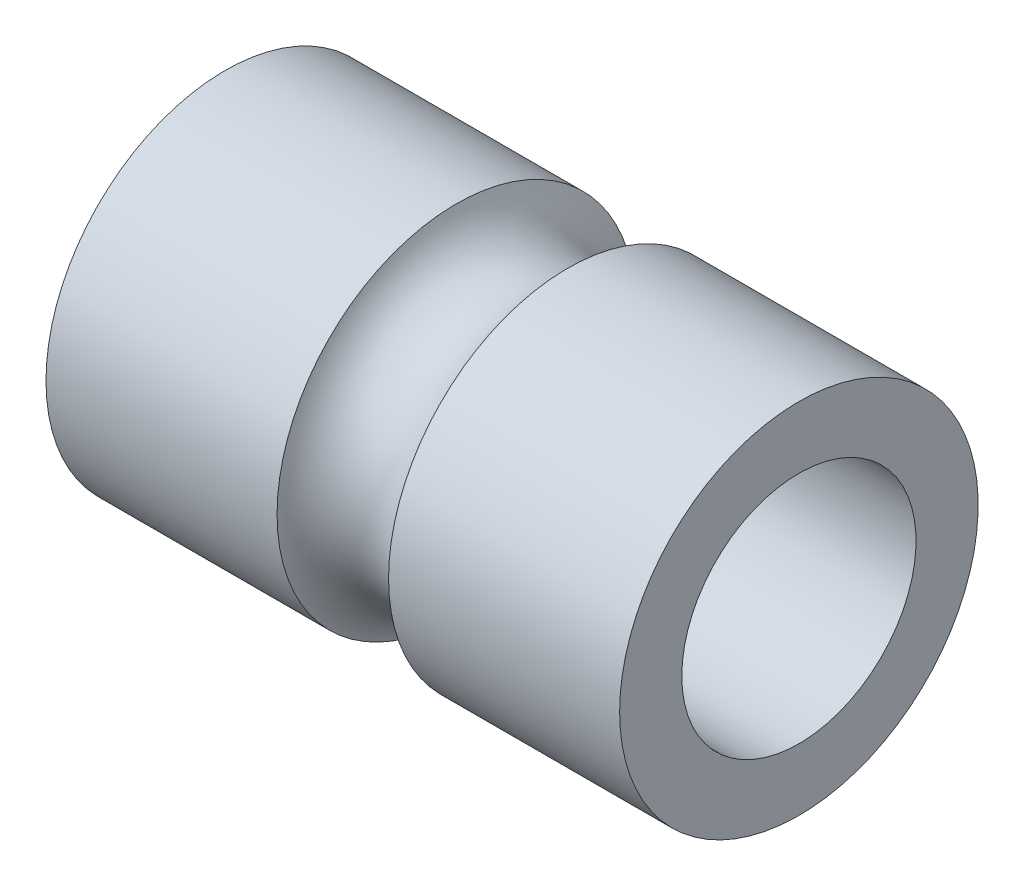
ISO-10303-21;
HEADER;
FILE_DESCRIPTION(('STEP AP214'),'2;1');
FILE_NAME('part.step','',(''),(''),'','','');
FILE_SCHEMA(('AUTOMOTIVE_DESIGN { 1 0 10303 214 1 1 1 1 }'));
ENDSEC;
DATA;
#1=APPLICATION_CONTEXT('core data for automotive mechanical design processes');
#2=APPLICATION_PROTOCOL_DEFINITION('international standard','automotive_design',2000,#1);
#3=PRODUCT_CONTEXT('',#1,'mechanical');
#4=PRODUCT('Part','Part','',(#3));
#5=PRODUCT_RELATED_PRODUCT_CATEGORY('part','',(#4));
#6=PRODUCT_DEFINITION_FORMATION('','',#4);
#7=PRODUCT_DEFINITION_CONTEXT('part definition',#1,'design');
#8=PRODUCT_DEFINITION('design','',#6,#7);
#9=PRODUCT_DEFINITION_SHAPE('','',#8);
#10=(LENGTH_UNIT() NAMED_UNIT(*) SI_UNIT(.MILLI.,.METRE.));
#11=(NAMED_UNIT(*) PLANE_ANGLE_UNIT() SI_UNIT($,.RADIAN.));
#12=(NAMED_UNIT(*) SI_UNIT($,.STERADIAN.) SOLID_ANGLE_UNIT());
#13=UNCERTAINTY_MEASURE_WITH_UNIT(LENGTH_MEASURE(1.E-05),#10,'distance_accuracy_value','');
#14=(GEOMETRIC_REPRESENTATION_CONTEXT(3) GLOBAL_UNCERTAINTY_ASSIGNED_CONTEXT((#13)) GLOBAL_UNIT_ASSIGNED_CONTEXT((#10,
#11,#12)) REPRESENTATION_CONTEXT('',''));
#15=CARTESIAN_POINT('',(0.,0.,0.));
#16=DIRECTION('',(0.,0.,1.));
#17=DIRECTION('',(1.,0.,0.));
#18=AXIS2_PLACEMENT_3D('',#15,#16,#17);
#19=CARTESIAN_POINT('',(6.,0.,0.));
#20=DIRECTION('',(-1.,0.,0.));
#21=DIRECTION('',(0.,0.,1.));
#22=AXIS2_PLACEMENT_3D('',#19,#20,#21);
#23=TOROIDAL_SURFACE('',#22,4.2,1.25);
#24=CARTESIAN_POINT('',(7.16619037896904,0.,0.));
#25=DIRECTION('',(-1.,0.,0.));
#26=DIRECTION('',(0.,0.,1.));
#27=AXIS2_PLACEMENT_3D('',#24,#25,#26);
#28=CIRCLE('',#27,3.75);
#29=CARTESIAN_POINT('',(7.16619037896904,0.,3.75));
#30=VERTEX_POINT('',#29);
#31=EDGE_CURVE('E54',#30,#30,#28,.T.);
#32=ORIENTED_EDGE('',*,*,#31,.T.);
#33=EDGE_LOOP('',(#32));
#34=FACE_BOUND('',#33,.T.);
#35=CARTESIAN_POINT('',(4.83380962103097,0.,0.));
#36=DIRECTION('',(-1.,0.,0.));
#37=DIRECTION('',(0.,0.,1.));
#38=AXIS2_PLACEMENT_3D('',#35,#36,#37);
#39=CIRCLE('',#38,3.75);
#40=CARTESIAN_POINT('',(4.83380962103097,0.,3.75));
#41=VERTEX_POINT('',#40);
#42=EDGE_CURVE('E10',#41,#41,#39,.T.);
#43=ORIENTED_EDGE('',*,*,#42,.F.);
#44=EDGE_LOOP('',(#43));
#45=FACE_BOUND('',#44,.T.);
#46=ADVANCED_FACE('F32',(#34,#45),#23,.F.);
#47=CARTESIAN_POINT('',(-1000.,0.,0.));
#48=DIRECTION('',(-1.,0.,0.));
#49=DIRECTION('',(0.,0.,1.));
#50=AXIS2_PLACEMENT_3D('',#47,#48,#49);
#51=CYLINDRICAL_SURFACE('',#50,3.75);
#52=CARTESIAN_POINT('',(0.,0.,0.));
#53=DIRECTION('',(-1.,0.,0.));
#54=DIRECTION('',(0.,0.,1.));
#55=AXIS2_PLACEMENT_3D('',#52,#53,#54);
#56=CIRCLE('',#55,3.75);
#57=CARTESIAN_POINT('',(0.,0.,3.75));
#58=VERTEX_POINT('',#57);
#59=EDGE_CURVE('E38',#58,#58,#56,.T.);
#60=ORIENTED_EDGE('',*,*,#59,.F.);
#61=EDGE_LOOP('',(#60));
#62=FACE_BOUND('',#61,.T.);
#63=ORIENTED_EDGE('',*,*,#42,.T.);
#64=EDGE_LOOP('',(#63));
#65=FACE_BOUND('',#64,.T.);
#66=ADVANCED_FACE('F80',(#62,#65),#51,.T.);
#67=CARTESIAN_POINT('',(0.,0.,0.));
#68=DIRECTION('',(1.,0.,0.));
#69=DIRECTION('',(0.,0.,-1.));
#70=AXIS2_PLACEMENT_3D('',#67,#68,#69);
#71=PLANE('',#70);
#72=CARTESIAN_POINT('',(0.,0.,0.));
#73=DIRECTION('',(-1.,0.,0.));
#74=DIRECTION('',(0.,0.,1.));
#75=AXIS2_PLACEMENT_3D('',#72,#73,#74);
#76=CIRCLE('',#75,2.45);
#77=CARTESIAN_POINT('',(0.,0.,2.45));
#78=VERTEX_POINT('',#77);
#79=EDGE_CURVE('E42',#78,#78,#76,.T.);
#80=ORIENTED_EDGE('',*,*,#79,.F.);
#81=EDGE_LOOP('',(#80));
#82=FACE_BOUND('',#81,.T.);
#83=ORIENTED_EDGE('',*,*,#59,.T.);
#84=EDGE_LOOP('',(#83));
#85=FACE_BOUND('',#84,.T.);
#86=ADVANCED_FACE('F75',(#82,#85),#71,.F.);
#87=CARTESIAN_POINT('',(-1000.,0.,0.));
#88=DIRECTION('',(-1.,0.,0.));
#89=DIRECTION('',(0.,0.,1.));
#90=AXIS2_PLACEMENT_3D('',#87,#88,#89);
#91=CYLINDRICAL_SURFACE('',#90,2.45);
#92=CARTESIAN_POINT('',(12.,0.,0.));
#93=DIRECTION('',(-1.,0.,0.));
#94=DIRECTION('',(0.,0.,1.));
#95=AXIS2_PLACEMENT_3D('',#92,#93,#94);
#96=CIRCLE('',#95,2.45);
#97=CARTESIAN_POINT('',(12.,0.,2.45));
#98=VERTEX_POINT('',#97);
#99=EDGE_CURVE('E46',#98,#98,#96,.T.);
#100=ORIENTED_EDGE('',*,*,#99,.F.);
#101=EDGE_LOOP('',(#100));
#102=FACE_BOUND('',#101,.T.);
#103=ORIENTED_EDGE('',*,*,#79,.T.);
#104=EDGE_LOOP('',(#103));
#105=FACE_BOUND('',#104,.T.);
#106=ADVANCED_FACE('F69',(#102,#105),#91,.F.);
#107=CARTESIAN_POINT('',(12.,0.,0.));
#108=DIRECTION('',(-1.,0.,0.));
#109=DIRECTION('',(0.,0.,1.));
#110=AXIS2_PLACEMENT_3D('',#107,#108,#109);
#111=PLANE('',#110);
#112=CARTESIAN_POINT('',(12.,0.,0.));
#113=DIRECTION('',(-1.,0.,0.));
#114=DIRECTION('',(0.,0.,1.));
#115=AXIS2_PLACEMENT_3D('',#112,#113,#114);
#116=CIRCLE('',#115,3.75);
#117=CARTESIAN_POINT('',(12.,0.,3.75));
#118=VERTEX_POINT('',#117);
#119=EDGE_CURVE('E51',#118,#118,#116,.T.);
#120=ORIENTED_EDGE('',*,*,#119,.F.);
#121=EDGE_LOOP('',(#120));
#122=FACE_BOUND('',#121,.T.);
#123=ORIENTED_EDGE('',*,*,#99,.T.);
#124=EDGE_LOOP('',(#123));
#125=FACE_BOUND('',#124,.T.);
#126=ADVANCED_FACE('F63',(#122,#125),#111,.F.);
#127=CARTESIAN_POINT('',(-1000.,0.,0.));
#128=DIRECTION('',(-1.,0.,0.));
#129=DIRECTION('',(0.,0.,1.));
#130=AXIS2_PLACEMENT_3D('',#127,#128,#129);
#131=CYLINDRICAL_SURFACE('',#130,3.75);
#132=ORIENTED_EDGE('',*,*,#31,.F.);
#133=EDGE_LOOP('',(#132));
#134=FACE_BOUND('',#133,.T.);
#135=ORIENTED_EDGE('',*,*,#119,.T.);
#136=EDGE_LOOP('',(#135));
#137=FACE_BOUND('',#136,.T.);
#138=ADVANCED_FACE('F60',(#134,#137),#131,.T.);
#139=CLOSED_SHELL('',(#46,#66,#86,#106,#126,#138));
#140=MANIFOLD_SOLID_BREP('B2',#139);
#141=ADVANCED_BREP_SHAPE_REPRESENTATION('',(#18,#140),#14);
#142=SHAPE_DEFINITION_REPRESENTATION(#9,#141);
ENDSEC;
END-ISO-10303-21;
